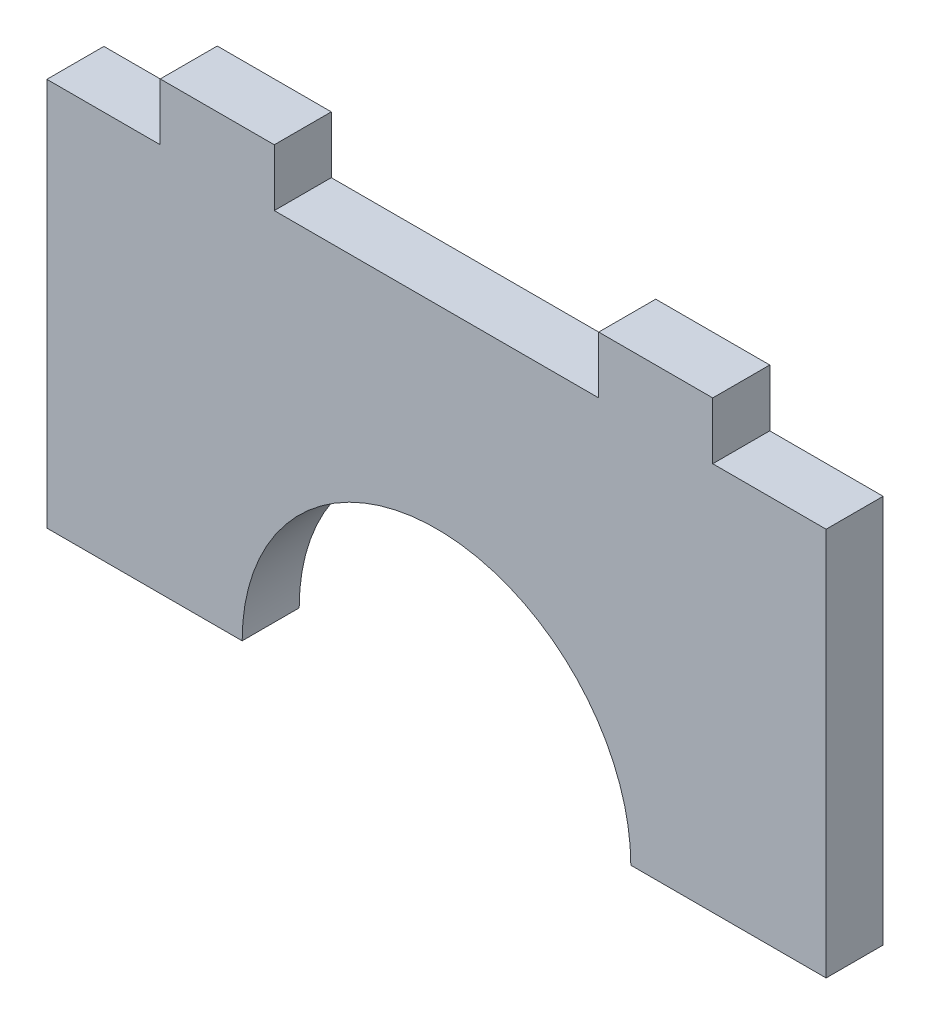
ISO-10303-21;
HEADER;
FILE_DESCRIPTION(('STEP AP214'),'2;1');
FILE_NAME('part.step','',(''),(''),'','','');
FILE_SCHEMA(('AUTOMOTIVE_DESIGN { 1 0 10303 214 1 1 1 1 }'));
ENDSEC;
DATA;
#1=APPLICATION_CONTEXT('core data for automotive mechanical design processes');
#2=APPLICATION_PROTOCOL_DEFINITION('international standard','automotive_design',2000,#1);
#3=PRODUCT_CONTEXT('',#1,'mechanical');
#4=PRODUCT('Part','Part','',(#3));
#5=PRODUCT_RELATED_PRODUCT_CATEGORY('part','',(#4));
#6=PRODUCT_DEFINITION_FORMATION('','',#4);
#7=PRODUCT_DEFINITION_CONTEXT('part definition',#1,'design');
#8=PRODUCT_DEFINITION('design','',#6,#7);
#9=PRODUCT_DEFINITION_SHAPE('','',#8);
#10=(LENGTH_UNIT() NAMED_UNIT(*) SI_UNIT(.MILLI.,.METRE.));
#11=(NAMED_UNIT(*) PLANE_ANGLE_UNIT() SI_UNIT($,.RADIAN.));
#12=(NAMED_UNIT(*) SI_UNIT($,.STERADIAN.) SOLID_ANGLE_UNIT());
#13=UNCERTAINTY_MEASURE_WITH_UNIT(LENGTH_MEASURE(1.E-05),#10,'distance_accuracy_value','');
#14=(GEOMETRIC_REPRESENTATION_CONTEXT(3) GLOBAL_UNCERTAINTY_ASSIGNED_CONTEXT((#13)) GLOBAL_UNIT_ASSIGNED_CONTEXT((#10,
#11,#12)) REPRESENTATION_CONTEXT('',''));
#15=CARTESIAN_POINT('',(0.,0.,0.));
#16=DIRECTION('',(0.,0.,1.));
#17=DIRECTION('',(1.,0.,0.));
#18=AXIS2_PLACEMENT_3D('',#15,#16,#17);
#19=CARTESIAN_POINT('',(0.,-10.225,3.));
#20=DIRECTION('',(0.,0.,-1.));
#21=DIRECTION('',(-1.,0.,0.));
#22=AXIS2_PLACEMENT_3D('',#19,#20,#21);
#23=CYLINDRICAL_SURFACE('',#22,10.225);
#24=CARTESIAN_POINT('',(0.,-10.225,0.));
#25=DIRECTION('',(0.,0.,1.));
#26=DIRECTION('',(1.,0.,0.));
#27=AXIS2_PLACEMENT_3D('',#24,#25,#26);
#28=CIRCLE('',#27,10.225);
#29=CARTESIAN_POINT('',(10.225,-10.225,0.));
#30=VERTEX_POINT('',#29);
#31=CARTESIAN_POINT('',(-10.225,-10.225,0.));
#32=VERTEX_POINT('',#31);
#33=EDGE_CURVE('E172',#30,#32,#28,.T.);
#34=ORIENTED_EDGE('',*,*,#33,.F.);
#35=DIRECTION('',(0.,0.,-1.));
#36=VECTOR('',#35,1.);
#37=CARTESIAN_POINT('',(10.225,-10.225,3.));
#38=LINE('',#37,#36);
#39=CARTESIAN_POINT('',(10.225,-10.225,3.));
#40=VERTEX_POINT('',#39);
#41=EDGE_CURVE('E11',#40,#30,#38,.T.);
#42=ORIENTED_EDGE('',*,*,#41,.F.);
#43=CARTESIAN_POINT('',(0.,-10.225,3.));
#44=DIRECTION('',(0.,0.,1.));
#45=DIRECTION('',(1.,0.,0.));
#46=AXIS2_PLACEMENT_3D('',#43,#44,#45);
#47=CIRCLE('',#46,10.225);
#48=CARTESIAN_POINT('',(-10.225,-10.225,3.));
#49=VERTEX_POINT('',#48);
#50=EDGE_CURVE('E205',#40,#49,#47,.T.);
#51=ORIENTED_EDGE('',*,*,#50,.T.);
#52=DIRECTION('',(0.,0.,-1.));
#53=VECTOR('',#52,1.);
#54=CARTESIAN_POINT('',(-10.225,-10.225,3.));
#55=LINE('',#54,#53);
#56=EDGE_CURVE('E57',#49,#32,#55,.T.);
#57=ORIENTED_EDGE('',*,*,#56,.T.);
#58=EDGE_LOOP('',(#34,#42,#51,#57));
#59=FACE_BOUND('',#58,.T.);
#60=ADVANCED_FACE('F41',(#59),#23,.F.);
#61=CARTESIAN_POINT('',(0.,-10.225,3.));
#62=DIRECTION('',(0.,-1.,0.));
#63=DIRECTION('',(0.,0.,-1.));
#64=AXIS2_PLACEMENT_3D('',#61,#62,#63);
#65=PLANE('',#64);
#66=DIRECTION('',(-1.,0.,0.));
#67=VECTOR('',#66,1.);
#68=CARTESIAN_POINT('',(0.,-10.225,0.));
#69=LINE('',#68,#67);
#70=CARTESIAN_POINT('',(20.5,-10.225,0.));
#71=VERTEX_POINT('',#70);
#72=EDGE_CURVE('E174',#71,#30,#69,.T.);
#73=ORIENTED_EDGE('',*,*,#72,.F.);
#74=DIRECTION('',(0.,0.,-1.));
#75=VECTOR('',#74,1.);
#76=CARTESIAN_POINT('',(20.5,-10.225,3.));
#77=LINE('',#76,#75);
#78=CARTESIAN_POINT('',(20.5,-10.225,3.));
#79=VERTEX_POINT('',#78);
#80=EDGE_CURVE('E49',#79,#71,#77,.T.);
#81=ORIENTED_EDGE('',*,*,#80,.F.);
#82=DIRECTION('',(-1.,0.,0.));
#83=VECTOR('',#82,1.);
#84=CARTESIAN_POINT('',(0.,-10.225,3.));
#85=LINE('',#84,#83);
#86=EDGE_CURVE('E243',#79,#40,#85,.T.);
#87=ORIENTED_EDGE('',*,*,#86,.T.);
#88=ORIENTED_EDGE('',*,*,#41,.T.);
#89=EDGE_LOOP('',(#73,#81,#87,#88));
#90=FACE_BOUND('',#89,.T.);
#91=ADVANCED_FACE('F242',(#90),#65,.T.);
#92=CARTESIAN_POINT('',(20.5,0.,3.));
#93=DIRECTION('',(-1.,0.,0.));
#94=DIRECTION('',(0.,0.,1.));
#95=AXIS2_PLACEMENT_3D('',#92,#93,#94);
#96=PLANE('',#95);
#97=DIRECTION('',(0.,1.,0.));
#98=VECTOR('',#97,1.);
#99=CARTESIAN_POINT('',(20.5,0.,0.));
#100=LINE('',#99,#98);
#101=CARTESIAN_POINT('',(20.5,10.225,0.));
#102=VERTEX_POINT('',#101);
#103=EDGE_CURVE('E177',#71,#102,#100,.T.);
#104=ORIENTED_EDGE('',*,*,#103,.T.);
#105=DIRECTION('',(0.,0.,-1.));
#106=VECTOR('',#105,1.);
#107=CARTESIAN_POINT('',(20.5,10.225,3.));
#108=LINE('',#107,#106);
#109=CARTESIAN_POINT('',(20.5,10.225,3.));
#110=VERTEX_POINT('',#109);
#111=EDGE_CURVE('E226',#110,#102,#108,.T.);
#112=ORIENTED_EDGE('',*,*,#111,.F.);
#113=DIRECTION('',(0.,1.,0.));
#114=VECTOR('',#113,1.);
#115=CARTESIAN_POINT('',(20.5,0.,3.));
#116=LINE('',#115,#114);
#117=EDGE_CURVE('E233',#79,#110,#116,.T.);
#118=ORIENTED_EDGE('',*,*,#117,.F.);
#119=ORIENTED_EDGE('',*,*,#80,.T.);
#120=EDGE_LOOP('',(#104,#112,#118,#119));
#121=FACE_BOUND('',#120,.T.);
#122=ADVANCED_FACE('F231',(#121),#96,.F.);
#123=CARTESIAN_POINT('',(0.,10.225,3.));
#124=DIRECTION('',(0.,-1.,0.));
#125=DIRECTION('',(0.,0.,-1.));
#126=AXIS2_PLACEMENT_3D('',#123,#124,#125);
#127=PLANE('',#126);
#128=DIRECTION('',(-1.,0.,0.));
#129=VECTOR('',#128,1.);
#130=CARTESIAN_POINT('',(0.,10.225,0.));
#131=LINE('',#130,#129);
#132=CARTESIAN_POINT('',(14.535,10.225,0.));
#133=VERTEX_POINT('',#132);
#134=EDGE_CURVE('E179',#102,#133,#131,.T.);
#135=ORIENTED_EDGE('',*,*,#134,.T.);
#136=DIRECTION('',(0.,0.,-1.));
#137=VECTOR('',#136,1.);
#138=CARTESIAN_POINT('',(14.535,10.225,3.));
#139=LINE('',#138,#137);
#140=CARTESIAN_POINT('',(14.535,10.225,3.));
#141=VERTEX_POINT('',#140);
#142=EDGE_CURVE('E223',#141,#133,#139,.T.);
#143=ORIENTED_EDGE('',*,*,#142,.F.);
#144=DIRECTION('',(-1.,0.,0.));
#145=VECTOR('',#144,1.);
#146=CARTESIAN_POINT('',(0.,10.225,3.));
#147=LINE('',#146,#145);
#148=EDGE_CURVE('E320',#110,#141,#147,.T.);
#149=ORIENTED_EDGE('',*,*,#148,.F.);
#150=ORIENTED_EDGE('',*,*,#111,.T.);
#151=EDGE_LOOP('',(#135,#143,#149,#150));
#152=FACE_BOUND('',#151,.T.);
#153=ADVANCED_FACE('F261',(#152),#127,.F.);
#154=CARTESIAN_POINT('',(14.535,0.,3.));
#155=DIRECTION('',(-1.,0.,0.));
#156=DIRECTION('',(0.,0.,1.));
#157=AXIS2_PLACEMENT_3D('',#154,#155,#156);
#158=PLANE('',#157);
#159=DIRECTION('',(0.,1.,0.));
#160=VECTOR('',#159,1.);
#161=CARTESIAN_POINT('',(14.535,0.,0.));
#162=LINE('',#161,#160);
#163=CARTESIAN_POINT('',(14.535,13.225,0.));
#164=VERTEX_POINT('',#163);
#165=EDGE_CURVE('E181',#133,#164,#162,.T.);
#166=ORIENTED_EDGE('',*,*,#165,.T.);
#167=DIRECTION('',(0.,0.,-1.));
#168=VECTOR('',#167,1.);
#169=CARTESIAN_POINT('',(14.535,13.225,3.));
#170=LINE('',#169,#168);
#171=CARTESIAN_POINT('',(14.535,13.225,3.));
#172=VERTEX_POINT('',#171);
#173=EDGE_CURVE('E220',#172,#164,#170,.T.);
#174=ORIENTED_EDGE('',*,*,#173,.F.);
#175=DIRECTION('',(0.,1.,0.));
#176=VECTOR('',#175,1.);
#177=CARTESIAN_POINT('',(14.535,0.,3.));
#178=LINE('',#177,#176);
#179=EDGE_CURVE('E318',#141,#172,#178,.T.);
#180=ORIENTED_EDGE('',*,*,#179,.F.);
#181=ORIENTED_EDGE('',*,*,#142,.T.);
#182=EDGE_LOOP('',(#166,#174,#180,#181));
#183=FACE_BOUND('',#182,.T.);
#184=ADVANCED_FACE('F266',(#183),#158,.F.);
#185=CARTESIAN_POINT('',(0.,13.225,3.));
#186=DIRECTION('',(0.,-1.,0.));
#187=DIRECTION('',(0.,0.,-1.));
#188=AXIS2_PLACEMENT_3D('',#185,#186,#187);
#189=PLANE('',#188);
#190=DIRECTION('',(-1.,0.,0.));
#191=VECTOR('',#190,1.);
#192=CARTESIAN_POINT('',(0.,13.225,0.));
#193=LINE('',#192,#191);
#194=CARTESIAN_POINT('',(8.535,13.225,0.));
#195=VERTEX_POINT('',#194);
#196=EDGE_CURVE('E183',#164,#195,#193,.T.);
#197=ORIENTED_EDGE('',*,*,#196,.T.);
#198=DIRECTION('',(0.,0.,-1.));
#199=VECTOR('',#198,1.);
#200=CARTESIAN_POINT('',(8.535,13.225,3.));
#201=LINE('',#200,#199);
#202=CARTESIAN_POINT('',(8.535,13.225,3.));
#203=VERTEX_POINT('',#202);
#204=EDGE_CURVE('E218',#203,#195,#201,.T.);
#205=ORIENTED_EDGE('',*,*,#204,.F.);
#206=DIRECTION('',(-1.,0.,0.));
#207=VECTOR('',#206,1.);
#208=CARTESIAN_POINT('',(0.,13.225,3.));
#209=LINE('',#208,#207);
#210=EDGE_CURVE('E316',#172,#203,#209,.T.);
#211=ORIENTED_EDGE('',*,*,#210,.F.);
#212=ORIENTED_EDGE('',*,*,#173,.T.);
#213=EDGE_LOOP('',(#197,#205,#211,#212));
#214=FACE_BOUND('',#213,.T.);
#215=ADVANCED_FACE('F270',(#214),#189,.F.);
#216=CARTESIAN_POINT('',(8.535,0.,3.));
#217=DIRECTION('',(-1.,0.,0.));
#218=DIRECTION('',(0.,0.,1.));
#219=AXIS2_PLACEMENT_3D('',#216,#217,#218);
#220=PLANE('',#219);
#221=DIRECTION('',(0.,1.,0.));
#222=VECTOR('',#221,1.);
#223=CARTESIAN_POINT('',(8.535,0.,0.));
#224=LINE('',#223,#222);
#225=CARTESIAN_POINT('',(8.535,10.225,0.));
#226=VERTEX_POINT('',#225);
#227=EDGE_CURVE('E186',#226,#195,#224,.T.);
#228=ORIENTED_EDGE('',*,*,#227,.F.);
#229=DIRECTION('',(0.,0.,-1.));
#230=VECTOR('',#229,1.);
#231=CARTESIAN_POINT('',(8.535,10.225,3.));
#232=LINE('',#231,#230);
#233=CARTESIAN_POINT('',(8.535,10.225,3.));
#234=VERTEX_POINT('',#233);
#235=EDGE_CURVE('E216',#234,#226,#232,.T.);
#236=ORIENTED_EDGE('',*,*,#235,.F.);
#237=DIRECTION('',(0.,1.,0.));
#238=VECTOR('',#237,1.);
#239=CARTESIAN_POINT('',(8.535,0.,3.));
#240=LINE('',#239,#238);
#241=EDGE_CURVE('E313',#234,#203,#240,.T.);
#242=ORIENTED_EDGE('',*,*,#241,.T.);
#243=ORIENTED_EDGE('',*,*,#204,.T.);
#244=EDGE_LOOP('',(#228,#236,#242,#243));
#245=FACE_BOUND('',#244,.T.);
#246=ADVANCED_FACE('F274',(#245),#220,.T.);
#247=CARTESIAN_POINT('',(0.,10.225,3.));
#248=DIRECTION('',(0.,-1.,0.));
#249=DIRECTION('',(0.,0.,-1.));
#250=AXIS2_PLACEMENT_3D('',#247,#248,#249);
#251=PLANE('',#250);
#252=DIRECTION('',(-1.,0.,0.));
#253=VECTOR('',#252,1.);
#254=CARTESIAN_POINT('',(0.,10.225,0.));
#255=LINE('',#254,#253);
#256=CARTESIAN_POINT('',(-8.535,10.225,0.));
#257=VERTEX_POINT('',#256);
#258=EDGE_CURVE('E189',#226,#257,#255,.T.);
#259=ORIENTED_EDGE('',*,*,#258,.T.);
#260=DIRECTION('',(0.,0.,-1.));
#261=VECTOR('',#260,1.);
#262=CARTESIAN_POINT('',(-8.535,10.225,3.));
#263=LINE('',#262,#261);
#264=CARTESIAN_POINT('',(-8.535,10.225,3.));
#265=VERTEX_POINT('',#264);
#266=EDGE_CURVE('E213',#265,#257,#263,.T.);
#267=ORIENTED_EDGE('',*,*,#266,.F.);
#268=DIRECTION('',(-1.,0.,0.));
#269=VECTOR('',#268,1.);
#270=CARTESIAN_POINT('',(0.,10.225,3.));
#271=LINE('',#270,#269);
#272=EDGE_CURVE('E155',#234,#265,#271,.T.);
#273=ORIENTED_EDGE('',*,*,#272,.F.);
#274=ORIENTED_EDGE('',*,*,#235,.T.);
#275=EDGE_LOOP('',(#259,#267,#273,#274));
#276=FACE_BOUND('',#275,.T.);
#277=ADVANCED_FACE('F278',(#276),#251,.F.);
#278=CARTESIAN_POINT('',(-8.535,0.,3.));
#279=DIRECTION('',(-1.,0.,0.));
#280=DIRECTION('',(0.,0.,1.));
#281=AXIS2_PLACEMENT_3D('',#278,#279,#280);
#282=PLANE('',#281);
#283=DIRECTION('',(0.,1.,0.));
#284=VECTOR('',#283,1.);
#285=CARTESIAN_POINT('',(-8.535,0.,0.));
#286=LINE('',#285,#284);
#287=CARTESIAN_POINT('',(-8.535,13.225,0.));
#288=VERTEX_POINT('',#287);
#289=EDGE_CURVE('E191',#257,#288,#286,.T.);
#290=ORIENTED_EDGE('',*,*,#289,.T.);
#291=DIRECTION('',(0.,0.,-1.));
#292=VECTOR('',#291,1.);
#293=CARTESIAN_POINT('',(-8.535,13.225,3.));
#294=LINE('',#293,#292);
#295=CARTESIAN_POINT('',(-8.535,13.225,3.));
#296=VERTEX_POINT('',#295);
#297=EDGE_CURVE('E211',#296,#288,#294,.T.);
#298=ORIENTED_EDGE('',*,*,#297,.F.);
#299=DIRECTION('',(0.,1.,0.));
#300=VECTOR('',#299,1.);
#301=CARTESIAN_POINT('',(-8.535,0.,3.));
#302=LINE('',#301,#300);
#303=EDGE_CURVE('E306',#265,#296,#302,.T.);
#304=ORIENTED_EDGE('',*,*,#303,.F.);
#305=ORIENTED_EDGE('',*,*,#266,.T.);
#306=EDGE_LOOP('',(#290,#298,#304,#305));
#307=FACE_BOUND('',#306,.T.);
#308=ADVANCED_FACE('F280',(#307),#282,.F.);
#309=CARTESIAN_POINT('',(0.,13.225,3.));
#310=DIRECTION('',(0.,1.,0.));
#311=DIRECTION('',(0.,0.,1.));
#312=AXIS2_PLACEMENT_3D('',#309,#310,#311);
#313=PLANE('',#312);
#314=DIRECTION('',(1.,0.,0.));
#315=VECTOR('',#314,1.);
#316=CARTESIAN_POINT('',(0.,13.225,0.));
#317=LINE('',#316,#315);
#318=CARTESIAN_POINT('',(-14.535,13.225,0.));
#319=VERTEX_POINT('',#318);
#320=EDGE_CURVE('E194',#319,#288,#317,.T.);
#321=ORIENTED_EDGE('',*,*,#320,.F.);
#322=DIRECTION('',(0.,0.,-1.));
#323=VECTOR('',#322,1.);
#324=CARTESIAN_POINT('',(-14.535,13.225,3.));
#325=LINE('',#324,#323);
#326=CARTESIAN_POINT('',(-14.535,13.225,3.));
#327=VERTEX_POINT('',#326);
#328=EDGE_CURVE('E209',#327,#319,#325,.T.);
#329=ORIENTED_EDGE('',*,*,#328,.F.);
#330=DIRECTION('',(1.,0.,0.));
#331=VECTOR('',#330,1.);
#332=CARTESIAN_POINT('',(0.,13.225,3.));
#333=LINE('',#332,#331);
#334=EDGE_CURVE('E310',#327,#296,#333,.T.);
#335=ORIENTED_EDGE('',*,*,#334,.T.);
#336=ORIENTED_EDGE('',*,*,#297,.T.);
#337=EDGE_LOOP('',(#321,#329,#335,#336));
#338=FACE_BOUND('',#337,.T.);
#339=ADVANCED_FACE('F283',(#338),#313,.T.);
#340=CARTESIAN_POINT('',(-14.535,0.,3.));
#341=DIRECTION('',(-1.,0.,0.));
#342=DIRECTION('',(0.,0.,1.));
#343=AXIS2_PLACEMENT_3D('',#340,#341,#342);
#344=PLANE('',#343);
#345=DIRECTION('',(0.,1.,0.));
#346=VECTOR('',#345,1.);
#347=CARTESIAN_POINT('',(-14.535,0.,0.));
#348=LINE('',#347,#346);
#349=CARTESIAN_POINT('',(-14.535,10.225,0.));
#350=VERTEX_POINT('',#349);
#351=EDGE_CURVE('E197',#350,#319,#348,.T.);
#352=ORIENTED_EDGE('',*,*,#351,.F.);
#353=DIRECTION('',(0.,0.,-1.));
#354=VECTOR('',#353,1.);
#355=CARTESIAN_POINT('',(-14.535,10.225,3.));
#356=LINE('',#355,#354);
#357=CARTESIAN_POINT('',(-14.535,10.225,3.));
#358=VERTEX_POINT('',#357);
#359=EDGE_CURVE('E163',#358,#350,#356,.T.);
#360=ORIENTED_EDGE('',*,*,#359,.F.);
#361=DIRECTION('',(0.,1.,0.));
#362=VECTOR('',#361,1.);
#363=CARTESIAN_POINT('',(-14.535,0.,3.));
#364=LINE('',#363,#362);
#365=EDGE_CURVE('E152',#358,#327,#364,.T.);
#366=ORIENTED_EDGE('',*,*,#365,.T.);
#367=ORIENTED_EDGE('',*,*,#328,.T.);
#368=EDGE_LOOP('',(#352,#360,#366,#367));
#369=FACE_BOUND('',#368,.T.);
#370=ADVANCED_FACE('F287',(#369),#344,.T.);
#371=CARTESIAN_POINT('',(-20.5,10.225,0.));
#372=VERTEX_POINT('',#371);
#373=EDGE_CURVE('E160',#350,#372,#255,.T.);
#374=ORIENTED_EDGE('',*,*,#373,.T.);
#375=DIRECTION('',(0.,0.,-1.));
#376=VECTOR('',#375,1.);
#377=CARTESIAN_POINT('',(-20.5,10.225,3.));
#378=LINE('',#377,#376);
#379=CARTESIAN_POINT('',(-20.5,10.225,3.));
#380=VERTEX_POINT('',#379);
#381=EDGE_CURVE('E157',#380,#372,#378,.T.);
#382=ORIENTED_EDGE('',*,*,#381,.F.);
#383=EDGE_CURVE('E144',#358,#380,#271,.T.);
#384=ORIENTED_EDGE('',*,*,#383,.F.);
#385=ORIENTED_EDGE('',*,*,#359,.T.);
#386=EDGE_LOOP('',(#374,#382,#384,#385));
#387=FACE_BOUND('',#386,.T.);
#388=ADVANCED_FACE('F158',(#387),#251,.F.);
#389=CARTESIAN_POINT('',(-20.5,0.,3.));
#390=DIRECTION('',(-1.,0.,0.));
#391=DIRECTION('',(0.,0.,1.));
#392=AXIS2_PLACEMENT_3D('',#389,#390,#391);
#393=PLANE('',#392);
#394=DIRECTION('',(0.,1.,0.));
#395=VECTOR('',#394,1.);
#396=CARTESIAN_POINT('',(-20.5,0.,0.));
#397=LINE('',#396,#395);
#398=CARTESIAN_POINT('',(-20.5,-10.225,0.));
#399=VERTEX_POINT('',#398);
#400=EDGE_CURVE('E200',#399,#372,#397,.T.);
#401=ORIENTED_EDGE('',*,*,#400,.F.);
#402=DIRECTION('',(0.,0.,-1.));
#403=VECTOR('',#402,1.);
#404=CARTESIAN_POINT('',(-20.5,-10.225,3.));
#405=LINE('',#404,#403);
#406=CARTESIAN_POINT('',(-20.5,-10.225,3.));
#407=VERTEX_POINT('',#406);
#408=EDGE_CURVE('E100',#407,#399,#405,.T.);
#409=ORIENTED_EDGE('',*,*,#408,.F.);
#410=DIRECTION('',(0.,1.,0.));
#411=VECTOR('',#410,1.);
#412=CARTESIAN_POINT('',(-20.5,0.,3.));
#413=LINE('',#412,#411);
#414=EDGE_CURVE('E149',#407,#380,#413,.T.);
#415=ORIENTED_EDGE('',*,*,#414,.T.);
#416=ORIENTED_EDGE('',*,*,#381,.T.);
#417=EDGE_LOOP('',(#401,#409,#415,#416));
#418=FACE_BOUND('',#417,.T.);
#419=ADVANCED_FACE('F165',(#418),#393,.T.);
#420=CARTESIAN_POINT('',(0.,-10.225,3.));
#421=DIRECTION('',(0.,-1.,0.));
#422=DIRECTION('',(0.,0.,-1.));
#423=AXIS2_PLACEMENT_3D('',#420,#421,#422);
#424=PLANE('',#423);
#425=DIRECTION('',(-1.,0.,0.));
#426=VECTOR('',#425,1.);
#427=CARTESIAN_POINT('',(0.,-10.225,0.));
#428=LINE('',#427,#426);
#429=EDGE_CURVE('E202',#32,#399,#428,.T.);
#430=ORIENTED_EDGE('',*,*,#429,.F.);
#431=ORIENTED_EDGE('',*,*,#56,.F.);
#432=DIRECTION('',(-1.,0.,0.));
#433=VECTOR('',#432,1.);
#434=CARTESIAN_POINT('',(0.,-10.225,3.));
#435=LINE('',#434,#433);
#436=EDGE_CURVE('E166',#49,#407,#435,.T.);
#437=ORIENTED_EDGE('',*,*,#436,.T.);
#438=ORIENTED_EDGE('',*,*,#408,.T.);
#439=EDGE_LOOP('',(#430,#431,#437,#438));
#440=FACE_BOUND('',#439,.T.);
#441=ADVANCED_FACE('F244',(#440),#424,.T.);
#442=CARTESIAN_POINT('',(0.,0.,3.));
#443=DIRECTION('',(0.,0.,1.));
#444=DIRECTION('',(1.,0.,0.));
#445=AXIS2_PLACEMENT_3D('',#442,#443,#444);
#446=PLANE('',#445);
#447=ORIENTED_EDGE('',*,*,#50,.F.);
#448=ORIENTED_EDGE('',*,*,#86,.F.);
#449=ORIENTED_EDGE('',*,*,#117,.T.);
#450=ORIENTED_EDGE('',*,*,#148,.T.);
#451=ORIENTED_EDGE('',*,*,#179,.T.);
#452=ORIENTED_EDGE('',*,*,#210,.T.);
#453=ORIENTED_EDGE('',*,*,#241,.F.);
#454=ORIENTED_EDGE('',*,*,#272,.T.);
#455=ORIENTED_EDGE('',*,*,#303,.T.);
#456=ORIENTED_EDGE('',*,*,#334,.F.);
#457=ORIENTED_EDGE('',*,*,#365,.F.);
#458=ORIENTED_EDGE('',*,*,#383,.T.);
#459=ORIENTED_EDGE('',*,*,#414,.F.);
#460=ORIENTED_EDGE('',*,*,#436,.F.);
#461=EDGE_LOOP('',(#447,#448,#449,#450,#451,#452,#453,#454,#455,#456,#457,#458,#459,#460));
#462=FACE_BOUND('',#461,.T.);
#463=ADVANCED_FACE('F146',(#462),#446,.T.);
#464=CARTESIAN_POINT('',(0.,0.,0.));
#465=DIRECTION('',(0.,0.,1.));
#466=DIRECTION('',(1.,0.,0.));
#467=AXIS2_PLACEMENT_3D('',#464,#465,#466);
#468=PLANE('',#467);
#469=ORIENTED_EDGE('',*,*,#33,.T.);
#470=ORIENTED_EDGE('',*,*,#429,.T.);
#471=ORIENTED_EDGE('',*,*,#400,.T.);
#472=ORIENTED_EDGE('',*,*,#373,.F.);
#473=ORIENTED_EDGE('',*,*,#351,.T.);
#474=ORIENTED_EDGE('',*,*,#320,.T.);
#475=ORIENTED_EDGE('',*,*,#289,.F.);
#476=ORIENTED_EDGE('',*,*,#258,.F.);
#477=ORIENTED_EDGE('',*,*,#227,.T.);
#478=ORIENTED_EDGE('',*,*,#196,.F.);
#479=ORIENTED_EDGE('',*,*,#165,.F.);
#480=ORIENTED_EDGE('',*,*,#134,.F.);
#481=ORIENTED_EDGE('',*,*,#103,.F.);
#482=ORIENTED_EDGE('',*,*,#72,.T.);
#483=EDGE_LOOP('',(#469,#470,#471,#472,#473,#474,#475,#476,#477,#478,#479,#480,#481,#482));
#484=FACE_BOUND('',#483,.T.);
#485=ADVANCED_FACE('F240',(#484),#468,.F.);
#486=CLOSED_SHELL('',(#60,#91,#122,#153,#184,#215,#246,#277,#308,#339,#370,#388,#419,#441,#463,#485));
#487=MANIFOLD_SOLID_BREP('B2',#486);
#488=ADVANCED_BREP_SHAPE_REPRESENTATION('',(#18,#487),#14);
#489=SHAPE_DEFINITION_REPRESENTATION(#9,#488);
ENDSEC;
END-ISO-10303-21;
